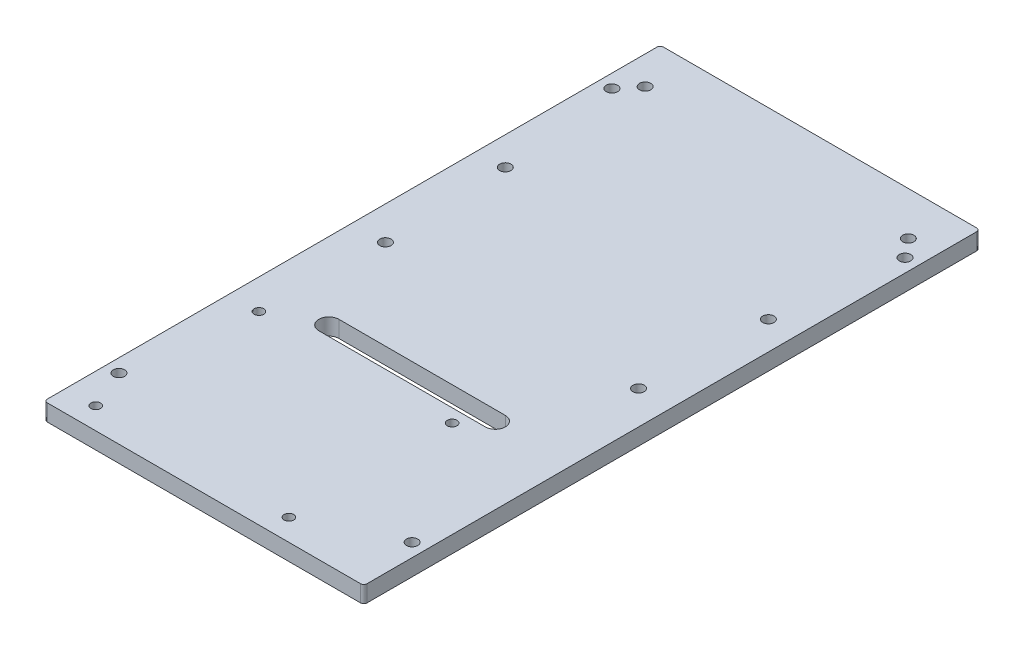
ISO-10303-21;
HEADER;
FILE_DESCRIPTION(('STEP AP214'),'2;1');
FILE_NAME('part.step','',(''),(''),'','','');
FILE_SCHEMA(('AUTOMOTIVE_DESIGN { 1 0 10303 214 1 1 1 1 }'));
ENDSEC;
DATA;
#1=APPLICATION_CONTEXT('core data for automotive mechanical design processes');
#2=APPLICATION_PROTOCOL_DEFINITION('international standard','automotive_design',2000,#1);
#3=PRODUCT_CONTEXT('',#1,'mechanical');
#4=PRODUCT('Part','Part','',(#3));
#5=PRODUCT_RELATED_PRODUCT_CATEGORY('part','',(#4));
#6=PRODUCT_DEFINITION_FORMATION('','',#4);
#7=PRODUCT_DEFINITION_CONTEXT('part definition',#1,'design');
#8=PRODUCT_DEFINITION('design','',#6,#7);
#9=PRODUCT_DEFINITION_SHAPE('','',#8);
#10=(LENGTH_UNIT() NAMED_UNIT(*) SI_UNIT(.MILLI.,.METRE.));
#11=(NAMED_UNIT(*) PLANE_ANGLE_UNIT() SI_UNIT($,.RADIAN.));
#12=(NAMED_UNIT(*) SI_UNIT($,.STERADIAN.) SOLID_ANGLE_UNIT());
#13=UNCERTAINTY_MEASURE_WITH_UNIT(LENGTH_MEASURE(1.E-05),#10,'distance_accuracy_value','');
#14=(GEOMETRIC_REPRESENTATION_CONTEXT(3) GLOBAL_UNCERTAINTY_ASSIGNED_CONTEXT((#13)) GLOBAL_UNIT_ASSIGNED_CONTEXT((#10,
#11,#12)) REPRESENTATION_CONTEXT('',''));
#15=CARTESIAN_POINT('',(0.,0.,0.));
#16=DIRECTION('',(0.,0.,1.));
#17=DIRECTION('',(1.,0.,0.));
#18=AXIS2_PLACEMENT_3D('',#15,#16,#17);
#19=CARTESIAN_POINT('',(48.,5.,-92.5));
#20=DIRECTION('',(-1.,0.,0.));
#21=DIRECTION('',(0.,0.,1.));
#22=AXIS2_PLACEMENT_3D('',#19,#20,#21);
#23=PLANE('',#22);
#24=DIRECTION('',(0.,0.,-1.));
#25=VECTOR('',#24,1.);
#26=CARTESIAN_POINT('',(48.,0.,-92.5));
#27=LINE('',#26,#25);
#28=CARTESIAN_POINT('',(48.,0.,91.5));
#29=VERTEX_POINT('',#28);
#30=CARTESIAN_POINT('',(48.,0.,-91.5));
#31=VERTEX_POINT('',#30);
#32=EDGE_CURVE('E242',#29,#31,#27,.T.);
#33=ORIENTED_EDGE('',*,*,#32,.T.);
#34=DIRECTION('',(0.,-1.,0.));
#35=VECTOR('',#34,1.);
#36=CARTESIAN_POINT('',(48.,5.,-91.5));
#37=LINE('',#36,#35);
#38=CARTESIAN_POINT('',(48.,5.,-91.5));
#39=VERTEX_POINT('',#38);
#40=EDGE_CURVE('E295',#31,#39,#37,.F.);
#41=ORIENTED_EDGE('',*,*,#40,.T.);
#42=DIRECTION('',(0.,0.,-1.));
#43=VECTOR('',#42,1.);
#44=CARTESIAN_POINT('',(48.,5.,-92.5));
#45=LINE('',#44,#43);
#46=CARTESIAN_POINT('',(48.,5.,91.5));
#47=VERTEX_POINT('',#46);
#48=EDGE_CURVE('E243',#47,#39,#45,.T.);
#49=ORIENTED_EDGE('',*,*,#48,.F.);
#50=DIRECTION('',(0.,-1.,0.));
#51=VECTOR('',#50,1.);
#52=CARTESIAN_POINT('',(48.,5.,91.5));
#53=LINE('',#52,#51);
#54=EDGE_CURVE('E292',#47,#29,#53,.T.);
#55=ORIENTED_EDGE('',*,*,#54,.T.);
#56=EDGE_LOOP('',(#33,#41,#49,#55));
#57=FACE_BOUND('',#56,.T.);
#58=ADVANCED_FACE('F34',(#57),#23,.F.);
#59=CARTESIAN_POINT('',(-48.,5.,-92.5));
#60=DIRECTION('',(0.,0.,1.));
#61=DIRECTION('',(1.,0.,0.));
#62=AXIS2_PLACEMENT_3D('',#59,#60,#61);
#63=PLANE('',#62);
#64=DIRECTION('',(-1.,0.,0.));
#65=VECTOR('',#64,1.);
#66=CARTESIAN_POINT('',(-48.,0.,-92.5));
#67=LINE('',#66,#65);
#68=CARTESIAN_POINT('',(47.,0.,-92.5));
#69=VERTEX_POINT('',#68);
#70=CARTESIAN_POINT('',(-47.,0.,-92.5));
#71=VERTEX_POINT('',#70);
#72=EDGE_CURVE('E259',#69,#71,#67,.T.);
#73=ORIENTED_EDGE('',*,*,#72,.T.);
#74=DIRECTION('',(0.,-1.,0.));
#75=VECTOR('',#74,1.);
#76=CARTESIAN_POINT('',(-47.,5.,-92.5));
#77=LINE('',#76,#75);
#78=CARTESIAN_POINT('',(-47.,5.,-92.5));
#79=VERTEX_POINT('',#78);
#80=EDGE_CURVE('E282',#71,#79,#77,.F.);
#81=ORIENTED_EDGE('',*,*,#80,.T.);
#82=DIRECTION('',(-1.,0.,0.));
#83=VECTOR('',#82,1.);
#84=CARTESIAN_POINT('',(-48.,5.,-92.5));
#85=LINE('',#84,#83);
#86=CARTESIAN_POINT('',(47.,5.,-92.5));
#87=VERTEX_POINT('',#86);
#88=EDGE_CURVE('E246',#87,#79,#85,.T.);
#89=ORIENTED_EDGE('',*,*,#88,.F.);
#90=DIRECTION('',(0.,-1.,0.));
#91=VECTOR('',#90,1.);
#92=CARTESIAN_POINT('',(47.,5.,-92.5));
#93=LINE('',#92,#91);
#94=EDGE_CURVE('E279',#87,#69,#93,.T.);
#95=ORIENTED_EDGE('',*,*,#94,.T.);
#96=EDGE_LOOP('',(#73,#81,#89,#95));
#97=FACE_BOUND('',#96,.T.);
#98=ADVANCED_FACE('F324',(#97),#63,.F.);
#99=CARTESIAN_POINT('',(-48.,5.,-92.5));
#100=DIRECTION('',(1.,0.,0.));
#101=DIRECTION('',(0.,0.,-1.));
#102=AXIS2_PLACEMENT_3D('',#99,#100,#101);
#103=PLANE('',#102);
#104=DIRECTION('',(0.,0.,1.));
#105=VECTOR('',#104,1.);
#106=CARTESIAN_POINT('',(-48.,5.,-92.5));
#107=LINE('',#106,#105);
#108=CARTESIAN_POINT('',(-48.,5.,-91.5));
#109=VERTEX_POINT('',#108);
#110=CARTESIAN_POINT('',(-48.,5.,91.5));
#111=VERTEX_POINT('',#110);
#112=EDGE_CURVE('E250',#109,#111,#107,.T.);
#113=ORIENTED_EDGE('',*,*,#112,.F.);
#114=DIRECTION('',(0.,-1.,0.));
#115=VECTOR('',#114,1.);
#116=CARTESIAN_POINT('',(-48.,5.,-91.5));
#117=LINE('',#116,#115);
#118=CARTESIAN_POINT('',(-48.,0.,-91.5));
#119=VERTEX_POINT('',#118);
#120=EDGE_CURVE('E268',#109,#119,#117,.T.);
#121=ORIENTED_EDGE('',*,*,#120,.T.);
#122=DIRECTION('',(0.,0.,1.));
#123=VECTOR('',#122,1.);
#124=CARTESIAN_POINT('',(-48.,0.,-92.5));
#125=LINE('',#124,#123);
#126=CARTESIAN_POINT('',(-48.,0.,91.5));
#127=VERTEX_POINT('',#126);
#128=EDGE_CURVE('E262',#119,#127,#125,.T.);
#129=ORIENTED_EDGE('',*,*,#128,.T.);
#130=DIRECTION('',(0.,-1.,0.));
#131=VECTOR('',#130,1.);
#132=CARTESIAN_POINT('',(-48.,5.,91.5));
#133=LINE('',#132,#131);
#134=EDGE_CURVE('E256',#127,#111,#133,.F.);
#135=ORIENTED_EDGE('',*,*,#134,.T.);
#136=EDGE_LOOP('',(#113,#121,#129,#135));
#137=FACE_BOUND('',#136,.T.);
#138=ADVANCED_FACE('F332',(#137),#103,.F.);
#139=CARTESIAN_POINT('',(-48.,5.,92.5));
#140=DIRECTION('',(0.,0.,-1.));
#141=DIRECTION('',(-1.,0.,0.));
#142=AXIS2_PLACEMENT_3D('',#139,#140,#141);
#143=PLANE('',#142);
#144=DIRECTION('',(1.,0.,0.));
#145=VECTOR('',#144,1.);
#146=CARTESIAN_POINT('',(-48.,0.,92.5));
#147=LINE('',#146,#145);
#148=CARTESIAN_POINT('',(-47.,0.,92.5));
#149=VERTEX_POINT('',#148);
#150=CARTESIAN_POINT('',(47.,0.,92.5));
#151=VERTEX_POINT('',#150);
#152=EDGE_CURVE('E247',#149,#151,#147,.T.);
#153=ORIENTED_EDGE('',*,*,#152,.T.);
#154=DIRECTION('',(0.,-1.,0.));
#155=VECTOR('',#154,1.);
#156=CARTESIAN_POINT('',(47.,5.,92.5));
#157=LINE('',#156,#155);
#158=CARTESIAN_POINT('',(47.,5.,92.5));
#159=VERTEX_POINT('',#158);
#160=EDGE_CURVE('E11',#151,#159,#157,.F.);
#161=ORIENTED_EDGE('',*,*,#160,.T.);
#162=DIRECTION('',(1.,0.,0.));
#163=VECTOR('',#162,1.);
#164=CARTESIAN_POINT('',(-48.,5.,92.5));
#165=LINE('',#164,#163);
#166=CARTESIAN_POINT('',(-47.,5.,92.5));
#167=VERTEX_POINT('',#166);
#168=EDGE_CURVE('E253',#167,#159,#165,.T.);
#169=ORIENTED_EDGE('',*,*,#168,.F.);
#170=DIRECTION('',(0.,-1.,0.));
#171=VECTOR('',#170,1.);
#172=CARTESIAN_POINT('',(-47.,5.,92.5));
#173=LINE('',#172,#171);
#174=EDGE_CURVE('E42',#167,#149,#173,.T.);
#175=ORIENTED_EDGE('',*,*,#174,.T.);
#176=EDGE_LOOP('',(#153,#161,#169,#175));
#177=FACE_BOUND('',#176,.T.);
#178=ADVANCED_FACE('F301',(#177),#143,.F.);
#179=CARTESIAN_POINT('',(0.,5.,0.));
#180=DIRECTION('',(0.,1.,0.));
#181=DIRECTION('',(0.,0.,1.));
#182=AXIS2_PLACEMENT_3D('',#179,#180,#181);
#183=PLANE('',#182);
#184=CARTESIAN_POINT('',(-25.,5.,30.));
#185=DIRECTION('',(0.,1.,0.));
#186=DIRECTION('',(0.,0.,1.));
#187=AXIS2_PLACEMENT_3D('',#184,#185,#186);
#188=CIRCLE('',#187,3.);
#189=CARTESIAN_POINT('',(-25.,5.,27.));
#190=VERTEX_POINT('',#189);
#191=CARTESIAN_POINT('',(-25.,5.,33.));
#192=VERTEX_POINT('',#191);
#193=EDGE_CURVE('E49',#190,#192,#188,.T.);
#194=ORIENTED_EDGE('',*,*,#193,.F.);
#195=DIRECTION('',(-1.,0.,0.));
#196=VECTOR('',#195,1.);
#197=CARTESIAN_POINT('',(-25.,5.,27.));
#198=LINE('',#197,#196);
#199=CARTESIAN_POINT('',(25.,5.,27.));
#200=VERTEX_POINT('',#199);
#201=EDGE_CURVE('E130',#200,#190,#198,.T.);
#202=ORIENTED_EDGE('',*,*,#201,.F.);
#203=CARTESIAN_POINT('',(25.,5.,30.));
#204=DIRECTION('',(0.,1.,0.));
#205=DIRECTION('',(0.,0.,1.));
#206=AXIS2_PLACEMENT_3D('',#203,#204,#205);
#207=CIRCLE('',#206,3.00000000000001);
#208=CARTESIAN_POINT('',(25.,5.,33.));
#209=VERTEX_POINT('',#208);
#210=EDGE_CURVE('E150',#209,#200,#207,.T.);
#211=ORIENTED_EDGE('',*,*,#210,.F.);
#212=DIRECTION('',(1.,0.,0.));
#213=VECTOR('',#212,1.);
#214=CARTESIAN_POINT('',(-25.,5.,33.));
#215=LINE('',#214,#213);
#216=EDGE_CURVE('E144',#192,#209,#215,.T.);
#217=ORIENTED_EDGE('',*,*,#216,.F.);
#218=EDGE_LOOP('',(#194,#202,#211,#217));
#219=FACE_BOUND('',#218,.T.);
#220=CARTESIAN_POINT('',(-39.49999847,5.,-79.47999944));
#221=DIRECTION('',(0.,1.,0.));
#222=DIRECTION('',(0.,0.,1.));
#223=AXIS2_PLACEMENT_3D('',#220,#221,#222);
#224=CIRCLE('',#223,1.7);
#225=CARTESIAN_POINT('',(-39.49999847,5.,-77.77999944));
#226=VERTEX_POINT('',#225);
#227=EDGE_CURVE('E136',#226,#226,#224,.T.);
#228=ORIENTED_EDGE('',*,*,#227,.F.);
#229=EDGE_LOOP('',(#228));
#230=FACE_BOUND('',#229,.T.);
#231=CARTESIAN_POINT('',(-39.49999847,5.,-37.47999962));
#232=DIRECTION('',(0.,1.,0.));
#233=DIRECTION('',(0.,0.,1.));
#234=AXIS2_PLACEMENT_3D('',#231,#232,#233);
#235=CIRCLE('',#234,1.7);
#236=CARTESIAN_POINT('',(-39.49999847,5.,-35.77999962));
#237=VERTEX_POINT('',#236);
#238=EDGE_CURVE('E164',#237,#237,#235,.T.);
#239=ORIENTED_EDGE('',*,*,#238,.F.);
#240=EDGE_LOOP('',(#239));
#241=FACE_BOUND('',#240,.T.);
#242=CARTESIAN_POINT('',(39.50000101,5.,-37.47999962));
#243=DIRECTION('',(0.,1.,0.));
#244=DIRECTION('',(0.,0.,1.));
#245=AXIS2_PLACEMENT_3D('',#242,#243,#244);
#246=CIRCLE('',#245,1.7);
#247=CARTESIAN_POINT('',(39.50000101,5.,-35.77999962));
#248=VERTEX_POINT('',#247);
#249=EDGE_CURVE('E170',#248,#248,#246,.T.);
#250=ORIENTED_EDGE('',*,*,#249,.F.);
#251=EDGE_LOOP('',(#250));
#252=FACE_BOUND('',#251,.T.);
#253=CARTESIAN_POINT('',(39.50000101,5.,-79.47999944));
#254=DIRECTION('',(0.,1.,0.));
#255=DIRECTION('',(0.,0.,1.));
#256=AXIS2_PLACEMENT_3D('',#253,#254,#255);
#257=CIRCLE('',#256,1.7);
#258=CARTESIAN_POINT('',(39.50000101,5.,-77.77999944));
#259=VERTEX_POINT('',#258);
#260=EDGE_CURVE('E176',#259,#259,#257,.T.);
#261=ORIENTED_EDGE('',*,*,#260,.F.);
#262=EDGE_LOOP('',(#261));
#263=FACE_BOUND('',#262,.T.);
#264=CARTESIAN_POINT('',(-39.,5.,85.9800000000001));
#265=DIRECTION('',(0.,1.,0.));
#266=DIRECTION('',(0.,0.,1.));
#267=AXIS2_PLACEMENT_3D('',#264,#265,#266);
#268=CIRCLE('',#267,1.45);
#269=CARTESIAN_POINT('',(-39.,5.,87.4300000000001));
#270=VERTEX_POINT('',#269);
#271=EDGE_CURVE('E182',#270,#270,#268,.T.);
#272=ORIENTED_EDGE('',*,*,#271,.F.);
#273=EDGE_LOOP('',(#272));
#274=FACE_BOUND('',#273,.T.);
#275=CARTESIAN_POINT('',(19.,5.,85.9800000000001));
#276=DIRECTION('',(0.,1.,0.));
#277=DIRECTION('',(0.,0.,1.));
#278=AXIS2_PLACEMENT_3D('',#275,#276,#277);
#279=CIRCLE('',#278,1.45);
#280=CARTESIAN_POINT('',(19.,5.,87.4300000000001));
#281=VERTEX_POINT('',#280);
#282=EDGE_CURVE('E188',#281,#281,#279,.T.);
#283=ORIENTED_EDGE('',*,*,#282,.F.);
#284=EDGE_LOOP('',(#283));
#285=FACE_BOUND('',#284,.T.);
#286=CARTESIAN_POINT('',(-39.,5.,36.9800000000001));
#287=DIRECTION('',(0.,1.,0.));
#288=DIRECTION('',(0.,0.,1.));
#289=AXIS2_PLACEMENT_3D('',#286,#287,#288);
#290=CIRCLE('',#289,1.45);
#291=CARTESIAN_POINT('',(-39.,5.,38.4300000000001));
#292=VERTEX_POINT('',#291);
#293=EDGE_CURVE('E194',#292,#292,#290,.T.);
#294=ORIENTED_EDGE('',*,*,#293,.F.);
#295=EDGE_LOOP('',(#294));
#296=FACE_BOUND('',#295,.T.);
#297=CARTESIAN_POINT('',(19.,5.,36.9800000000001));
#298=DIRECTION('',(0.,1.,0.));
#299=DIRECTION('',(0.,0.,1.));
#300=AXIS2_PLACEMENT_3D('',#297,#298,#299);
#301=CIRCLE('',#300,1.45);
#302=CARTESIAN_POINT('',(19.,5.,38.4300000000001));
#303=VERTEX_POINT('',#302);
#304=EDGE_CURVE('E200',#303,#303,#301,.T.);
#305=ORIENTED_EDGE('',*,*,#304,.F.);
#306=EDGE_LOOP('',(#305));
#307=FACE_BOUND('',#306,.T.);
#308=CARTESIAN_POINT('',(38.,5.,0.));
#309=DIRECTION('',(0.,1.,0.));
#310=DIRECTION('',(0.,0.,1.));
#311=AXIS2_PLACEMENT_3D('',#308,#309,#310);
#312=CIRCLE('',#311,1.7);
#313=CARTESIAN_POINT('',(38.,5.,1.69999999999999));
#314=VERTEX_POINT('',#313);
#315=EDGE_CURVE('E207',#314,#314,#312,.T.);
#316=ORIENTED_EDGE('',*,*,#315,.F.);
#317=EDGE_LOOP('',(#316));
#318=FACE_BOUND('',#317,.T.);
#319=CARTESIAN_POINT('',(-38.,5.,0.));
#320=DIRECTION('',(0.,1.,0.));
#321=DIRECTION('',(0.,0.,1.));
#322=AXIS2_PLACEMENT_3D('',#319,#320,#321);
#323=CIRCLE('',#322,1.7);
#324=CARTESIAN_POINT('',(-38.,5.,1.7));
#325=VERTEX_POINT('',#324);
#326=EDGE_CURVE('E206',#325,#325,#323,.T.);
#327=ORIENTED_EDGE('',*,*,#326,.F.);
#328=EDGE_LOOP('',(#327));
#329=FACE_BOUND('',#328,.T.);
#330=CARTESIAN_POINT('',(-44.,5.,-74.));
#331=DIRECTION('',(0.,1.,0.));
#332=DIRECTION('',(0.,0.,1.));
#333=AXIS2_PLACEMENT_3D('',#330,#331,#332);
#334=CIRCLE('',#333,1.7);
#335=CARTESIAN_POINT('',(-44.,5.,-72.3));
#336=VERTEX_POINT('',#335);
#337=EDGE_CURVE('E225',#336,#336,#334,.T.);
#338=ORIENTED_EDGE('',*,*,#337,.F.);
#339=EDGE_LOOP('',(#338));
#340=FACE_BOUND('',#339,.T.);
#341=CARTESIAN_POINT('',(44.,5.,74.));
#342=DIRECTION('',(0.,1.,0.));
#343=DIRECTION('',(0.,0.,1.));
#344=AXIS2_PLACEMENT_3D('',#341,#342,#343);
#345=CIRCLE('',#344,1.70000000000001);
#346=CARTESIAN_POINT('',(44.,5.,75.7));
#347=VERTEX_POINT('',#346);
#348=EDGE_CURVE('E224',#347,#347,#345,.T.);
#349=ORIENTED_EDGE('',*,*,#348,.F.);
#350=EDGE_LOOP('',(#349));
#351=FACE_BOUND('',#350,.T.);
#352=CARTESIAN_POINT('',(-44.,5.,74.));
#353=DIRECTION('',(0.,1.,0.));
#354=DIRECTION('',(0.,0.,1.));
#355=AXIS2_PLACEMENT_3D('',#352,#353,#354);
#356=CIRCLE('',#355,1.7);
#357=CARTESIAN_POINT('',(-44.,5.,75.7));
#358=VERTEX_POINT('',#357);
#359=EDGE_CURVE('E214',#358,#358,#356,.T.);
#360=ORIENTED_EDGE('',*,*,#359,.F.);
#361=EDGE_LOOP('',(#360));
#362=FACE_BOUND('',#361,.T.);
#363=CARTESIAN_POINT('',(44.,5.,-74.));
#364=DIRECTION('',(0.,1.,0.));
#365=DIRECTION('',(0.,0.,1.));
#366=AXIS2_PLACEMENT_3D('',#363,#364,#365);
#367=CIRCLE('',#366,1.70000000000001);
#368=CARTESIAN_POINT('',(44.,5.,-72.3));
#369=VERTEX_POINT('',#368);
#370=EDGE_CURVE('E232',#369,#369,#367,.T.);
#371=ORIENTED_EDGE('',*,*,#370,.F.);
#372=EDGE_LOOP('',(#371));
#373=FACE_BOUND('',#372,.T.);
#374=ORIENTED_EDGE('',*,*,#88,.T.);
#375=CARTESIAN_POINT('',(-47.,5.,-91.5));
#376=DIRECTION('',(0.,1.,0.));
#377=DIRECTION('',(0.,0.,1.));
#378=AXIS2_PLACEMENT_3D('',#375,#376,#377);
#379=CIRCLE('',#378,1.);
#380=EDGE_CURVE('E290',#79,#109,#379,.T.);
#381=ORIENTED_EDGE('',*,*,#380,.T.);
#382=ORIENTED_EDGE('',*,*,#112,.T.);
#383=CARTESIAN_POINT('',(-47.,5.,91.5));
#384=DIRECTION('',(0.,1.,0.));
#385=DIRECTION('',(0.,0.,1.));
#386=AXIS2_PLACEMENT_3D('',#383,#384,#385);
#387=CIRCLE('',#386,1.);
#388=EDGE_CURVE('E284',#111,#167,#387,.T.);
#389=ORIENTED_EDGE('',*,*,#388,.T.);
#390=ORIENTED_EDGE('',*,*,#168,.T.);
#391=CARTESIAN_POINT('',(47.,5.,91.5));
#392=DIRECTION('',(0.,1.,0.));
#393=DIRECTION('',(0.,0.,1.));
#394=AXIS2_PLACEMENT_3D('',#391,#392,#393);
#395=CIRCLE('',#394,1.);
#396=EDGE_CURVE('E286',#159,#47,#395,.T.);
#397=ORIENTED_EDGE('',*,*,#396,.T.);
#398=ORIENTED_EDGE('',*,*,#48,.T.);
#399=CARTESIAN_POINT('',(47.,5.,-91.5));
#400=DIRECTION('',(0.,1.,0.));
#401=DIRECTION('',(0.,0.,1.));
#402=AXIS2_PLACEMENT_3D('',#399,#400,#401);
#403=CIRCLE('',#402,1.);
#404=EDGE_CURVE('E288',#39,#87,#403,.T.);
#405=ORIENTED_EDGE('',*,*,#404,.T.);
#406=EDGE_LOOP('',(#374,#381,#382,#389,#390,#397,#398,#405));
#407=FACE_BOUND('',#406,.T.);
#408=ADVANCED_FACE('F317',(#219,#230,#241,#252,#263,#274,#285,#296,#307,#318,#329,#340,#351,
#362,#373,#407),#183,.T.);
#409=CARTESIAN_POINT('',(0.,0.,0.));
#410=DIRECTION('',(0.,1.,0.));
#411=DIRECTION('',(0.,0.,1.));
#412=AXIS2_PLACEMENT_3D('',#409,#410,#411);
#413=PLANE('',#412);
#414=DIRECTION('',(1.,0.,0.));
#415=VECTOR('',#414,1.);
#416=CARTESIAN_POINT('',(-25.,0.,27.));
#417=LINE('',#416,#415);
#418=CARTESIAN_POINT('',(-25.,0.,27.));
#419=VERTEX_POINT('',#418);
#420=CARTESIAN_POINT('',(25.,0.,27.));
#421=VERTEX_POINT('',#420);
#422=EDGE_CURVE('E142',#419,#421,#417,.T.);
#423=ORIENTED_EDGE('',*,*,#422,.F.);
#424=CARTESIAN_POINT('',(-25.,0.,30.));
#425=DIRECTION('',(0.,1.,0.));
#426=DIRECTION('',(0.,0.,1.));
#427=AXIS2_PLACEMENT_3D('',#424,#425,#426);
#428=CIRCLE('',#427,3.);
#429=CARTESIAN_POINT('',(-25.,0.,33.));
#430=VERTEX_POINT('',#429);
#431=EDGE_CURVE('E124',#430,#419,#428,.F.);
#432=ORIENTED_EDGE('',*,*,#431,.F.);
#433=DIRECTION('',(-1.,0.,0.));
#434=VECTOR('',#433,1.);
#435=CARTESIAN_POINT('',(-25.,0.,33.));
#436=LINE('',#435,#434);
#437=CARTESIAN_POINT('',(25.,0.,33.));
#438=VERTEX_POINT('',#437);
#439=EDGE_CURVE('E133',#438,#430,#436,.T.);
#440=ORIENTED_EDGE('',*,*,#439,.F.);
#441=CARTESIAN_POINT('',(25.,0.,30.));
#442=DIRECTION('',(0.,1.,0.));
#443=DIRECTION('',(0.,0.,1.));
#444=AXIS2_PLACEMENT_3D('',#441,#442,#443);
#445=CIRCLE('',#444,3.00000000000001);
#446=EDGE_CURVE('E57',#421,#438,#445,.F.);
#447=ORIENTED_EDGE('',*,*,#446,.F.);
#448=EDGE_LOOP('',(#423,#432,#440,#447));
#449=FACE_BOUND('',#448,.T.);
#450=CARTESIAN_POINT('',(-39.49999847,0.,-79.47999944));
#451=DIRECTION('',(0.,1.,0.));
#452=DIRECTION('',(0.,0.,1.));
#453=AXIS2_PLACEMENT_3D('',#450,#451,#452);
#454=CIRCLE('',#453,1.7);
#455=CARTESIAN_POINT('',(-39.49999847,0.,-77.77999944));
#456=VERTEX_POINT('',#455);
#457=EDGE_CURVE('E161',#456,#456,#454,.T.);
#458=ORIENTED_EDGE('',*,*,#457,.T.);
#459=EDGE_LOOP('',(#458));
#460=FACE_BOUND('',#459,.T.);
#461=CARTESIAN_POINT('',(-39.49999847,0.,-37.47999962));
#462=DIRECTION('',(0.,1.,0.));
#463=DIRECTION('',(0.,0.,1.));
#464=AXIS2_PLACEMENT_3D('',#461,#462,#463);
#465=CIRCLE('',#464,1.7);
#466=CARTESIAN_POINT('',(-39.49999847,0.,-35.77999962));
#467=VERTEX_POINT('',#466);
#468=EDGE_CURVE('E167',#467,#467,#465,.T.);
#469=ORIENTED_EDGE('',*,*,#468,.T.);
#470=EDGE_LOOP('',(#469));
#471=FACE_BOUND('',#470,.T.);
#472=CARTESIAN_POINT('',(39.50000101,0.,-37.47999962));
#473=DIRECTION('',(0.,1.,0.));
#474=DIRECTION('',(0.,0.,1.));
#475=AXIS2_PLACEMENT_3D('',#472,#473,#474);
#476=CIRCLE('',#475,1.7);
#477=CARTESIAN_POINT('',(39.50000101,0.,-35.77999962));
#478=VERTEX_POINT('',#477);
#479=EDGE_CURVE('E173',#478,#478,#476,.T.);
#480=ORIENTED_EDGE('',*,*,#479,.T.);
#481=EDGE_LOOP('',(#480));
#482=FACE_BOUND('',#481,.T.);
#483=CARTESIAN_POINT('',(39.50000101,0.,-79.47999944));
#484=DIRECTION('',(0.,1.,0.));
#485=DIRECTION('',(0.,0.,1.));
#486=AXIS2_PLACEMENT_3D('',#483,#484,#485);
#487=CIRCLE('',#486,1.7);
#488=CARTESIAN_POINT('',(39.50000101,0.,-77.77999944));
#489=VERTEX_POINT('',#488);
#490=EDGE_CURVE('E179',#489,#489,#487,.T.);
#491=ORIENTED_EDGE('',*,*,#490,.T.);
#492=EDGE_LOOP('',(#491));
#493=FACE_BOUND('',#492,.T.);
#494=CARTESIAN_POINT('',(-39.,0.,85.9800000000001));
#495=DIRECTION('',(0.,1.,0.));
#496=DIRECTION('',(0.,0.,1.));
#497=AXIS2_PLACEMENT_3D('',#494,#495,#496);
#498=CIRCLE('',#497,1.45);
#499=CARTESIAN_POINT('',(-39.,0.,87.4300000000001));
#500=VERTEX_POINT('',#499);
#501=EDGE_CURVE('E185',#500,#500,#498,.T.);
#502=ORIENTED_EDGE('',*,*,#501,.T.);
#503=EDGE_LOOP('',(#502));
#504=FACE_BOUND('',#503,.T.);
#505=CARTESIAN_POINT('',(19.,0.,85.9800000000001));
#506=DIRECTION('',(0.,1.,0.));
#507=DIRECTION('',(0.,0.,1.));
#508=AXIS2_PLACEMENT_3D('',#505,#506,#507);
#509=CIRCLE('',#508,1.45);
#510=CARTESIAN_POINT('',(19.,0.,87.4300000000001));
#511=VERTEX_POINT('',#510);
#512=EDGE_CURVE('E191',#511,#511,#509,.T.);
#513=ORIENTED_EDGE('',*,*,#512,.T.);
#514=EDGE_LOOP('',(#513));
#515=FACE_BOUND('',#514,.T.);
#516=CARTESIAN_POINT('',(-39.,0.,36.9800000000001));
#517=DIRECTION('',(0.,1.,0.));
#518=DIRECTION('',(0.,0.,1.));
#519=AXIS2_PLACEMENT_3D('',#516,#517,#518);
#520=CIRCLE('',#519,1.45);
#521=CARTESIAN_POINT('',(-39.,0.,38.4300000000001));
#522=VERTEX_POINT('',#521);
#523=EDGE_CURVE('E197',#522,#522,#520,.T.);
#524=ORIENTED_EDGE('',*,*,#523,.T.);
#525=EDGE_LOOP('',(#524));
#526=FACE_BOUND('',#525,.T.);
#527=CARTESIAN_POINT('',(19.,0.,36.9800000000001));
#528=DIRECTION('',(0.,1.,0.));
#529=DIRECTION('',(0.,0.,1.));
#530=AXIS2_PLACEMENT_3D('',#527,#528,#529);
#531=CIRCLE('',#530,1.45);
#532=CARTESIAN_POINT('',(19.,0.,38.4300000000001));
#533=VERTEX_POINT('',#532);
#534=EDGE_CURVE('E203',#533,#533,#531,.T.);
#535=ORIENTED_EDGE('',*,*,#534,.T.);
#536=EDGE_LOOP('',(#535));
#537=FACE_BOUND('',#536,.T.);
#538=CARTESIAN_POINT('',(38.,0.,0.));
#539=DIRECTION('',(0.,1.,0.));
#540=DIRECTION('',(0.,0.,1.));
#541=AXIS2_PLACEMENT_3D('',#538,#539,#540);
#542=CIRCLE('',#541,1.7);
#543=CARTESIAN_POINT('',(38.,0.,1.69999999999999));
#544=VERTEX_POINT('',#543);
#545=EDGE_CURVE('E210',#544,#544,#542,.F.);
#546=ORIENTED_EDGE('',*,*,#545,.F.);
#547=EDGE_LOOP('',(#546));
#548=FACE_BOUND('',#547,.T.);
#549=CARTESIAN_POINT('',(-38.,0.,0.));
#550=DIRECTION('',(0.,1.,0.));
#551=DIRECTION('',(0.,0.,1.));
#552=AXIS2_PLACEMENT_3D('',#549,#550,#551);
#553=CIRCLE('',#552,1.7);
#554=CARTESIAN_POINT('',(-38.,0.,1.7));
#555=VERTEX_POINT('',#554);
#556=EDGE_CURVE('E211',#555,#555,#553,.F.);
#557=ORIENTED_EDGE('',*,*,#556,.F.);
#558=EDGE_LOOP('',(#557));
#559=FACE_BOUND('',#558,.T.);
#560=CARTESIAN_POINT('',(-44.,0.,-74.));
#561=DIRECTION('',(0.,1.,0.));
#562=DIRECTION('',(0.,0.,1.));
#563=AXIS2_PLACEMENT_3D('',#560,#561,#562);
#564=CIRCLE('',#563,1.7);
#565=CARTESIAN_POINT('',(-44.,0.,-72.3));
#566=VERTEX_POINT('',#565);
#567=EDGE_CURVE('E228',#566,#566,#564,.F.);
#568=ORIENTED_EDGE('',*,*,#567,.F.);
#569=EDGE_LOOP('',(#568));
#570=FACE_BOUND('',#569,.T.);
#571=CARTESIAN_POINT('',(44.,0.,74.));
#572=DIRECTION('',(0.,1.,0.));
#573=DIRECTION('',(0.,0.,1.));
#574=AXIS2_PLACEMENT_3D('',#571,#572,#573);
#575=CIRCLE('',#574,1.70000000000001);
#576=CARTESIAN_POINT('',(44.,0.,75.7));
#577=VERTEX_POINT('',#576);
#578=EDGE_CURVE('E229',#577,#577,#575,.F.);
#579=ORIENTED_EDGE('',*,*,#578,.F.);
#580=EDGE_LOOP('',(#579));
#581=FACE_BOUND('',#580,.T.);
#582=CARTESIAN_POINT('',(-44.,0.,74.));
#583=DIRECTION('',(0.,1.,0.));
#584=DIRECTION('',(0.,0.,1.));
#585=AXIS2_PLACEMENT_3D('',#582,#583,#584);
#586=CIRCLE('',#585,1.7);
#587=CARTESIAN_POINT('',(-44.,0.,75.7));
#588=VERTEX_POINT('',#587);
#589=EDGE_CURVE('E221',#588,#588,#586,.F.);
#590=ORIENTED_EDGE('',*,*,#589,.F.);
#591=EDGE_LOOP('',(#590));
#592=FACE_BOUND('',#591,.T.);
#593=CARTESIAN_POINT('',(44.,0.,-74.));
#594=DIRECTION('',(0.,1.,0.));
#595=DIRECTION('',(0.,0.,1.));
#596=AXIS2_PLACEMENT_3D('',#593,#594,#595);
#597=CIRCLE('',#596,1.70000000000001);
#598=CARTESIAN_POINT('',(44.,0.,-72.3));
#599=VERTEX_POINT('',#598);
#600=EDGE_CURVE('E239',#599,#599,#597,.F.);
#601=ORIENTED_EDGE('',*,*,#600,.F.);
#602=EDGE_LOOP('',(#601));
#603=FACE_BOUND('',#602,.T.);
#604=ORIENTED_EDGE('',*,*,#128,.F.);
#605=CARTESIAN_POINT('',(-47.,0.,-91.5));
#606=DIRECTION('',(0.,1.,0.));
#607=DIRECTION('',(0.,0.,1.));
#608=AXIS2_PLACEMENT_3D('',#605,#606,#607);
#609=CIRCLE('',#608,1.);
#610=EDGE_CURVE('E277',#119,#71,#609,.F.);
#611=ORIENTED_EDGE('',*,*,#610,.T.);
#612=ORIENTED_EDGE('',*,*,#72,.F.);
#613=CARTESIAN_POINT('',(47.,0.,-91.5));
#614=DIRECTION('',(0.,1.,0.));
#615=DIRECTION('',(0.,0.,1.));
#616=AXIS2_PLACEMENT_3D('',#613,#614,#615);
#617=CIRCLE('',#616,1.);
#618=EDGE_CURVE('E275',#69,#31,#617,.F.);
#619=ORIENTED_EDGE('',*,*,#618,.T.);
#620=ORIENTED_EDGE('',*,*,#32,.F.);
#621=CARTESIAN_POINT('',(47.,0.,91.5));
#622=DIRECTION('',(0.,1.,0.));
#623=DIRECTION('',(0.,0.,1.));
#624=AXIS2_PLACEMENT_3D('',#621,#622,#623);
#625=CIRCLE('',#624,1.);
#626=EDGE_CURVE('E273',#29,#151,#625,.F.);
#627=ORIENTED_EDGE('',*,*,#626,.T.);
#628=ORIENTED_EDGE('',*,*,#152,.F.);
#629=CARTESIAN_POINT('',(-47.,0.,91.5));
#630=DIRECTION('',(0.,1.,0.));
#631=DIRECTION('',(0.,0.,1.));
#632=AXIS2_PLACEMENT_3D('',#629,#630,#631);
#633=CIRCLE('',#632,1.);
#634=EDGE_CURVE('E271',#149,#127,#633,.F.);
#635=ORIENTED_EDGE('',*,*,#634,.T.);
#636=EDGE_LOOP('',(#604,#611,#612,#619,#620,#627,#628,#635));
#637=FACE_BOUND('',#636,.T.);
#638=ADVANCED_FACE('F139',(#449,#460,#471,#482,#493,#504,#515,#526,#537,#548,#559,#570,#581,
#592,#603,#637),#413,.F.);
#639=CARTESIAN_POINT('',(44.,-0.00100000000000013,-74.));
#640=DIRECTION('',(0.,1.,0.));
#641=DIRECTION('',(0.,0.,1.));
#642=AXIS2_PLACEMENT_3D('',#639,#640,#641);
#643=CYLINDRICAL_SURFACE('',#642,1.70000000000001);
#644=ORIENTED_EDGE('',*,*,#370,.T.);
#645=EDGE_LOOP('',(#644));
#646=FACE_BOUND('',#645,.T.);
#647=ORIENTED_EDGE('',*,*,#600,.T.);
#648=EDGE_LOOP('',(#647));
#649=FACE_BOUND('',#648,.T.);
#650=ADVANCED_FACE('F461',(#646,#649),#643,.F.);
#651=CARTESIAN_POINT('',(-44.,-0.00100000000000013,74.));
#652=DIRECTION('',(0.,1.,0.));
#653=DIRECTION('',(0.,0.,1.));
#654=AXIS2_PLACEMENT_3D('',#651,#652,#653);
#655=CYLINDRICAL_SURFACE('',#654,1.7);
#656=ORIENTED_EDGE('',*,*,#359,.T.);
#657=EDGE_LOOP('',(#656));
#658=FACE_BOUND('',#657,.T.);
#659=ORIENTED_EDGE('',*,*,#589,.T.);
#660=EDGE_LOOP('',(#659));
#661=FACE_BOUND('',#660,.T.);
#662=ADVANCED_FACE('F506',(#658,#661),#655,.F.);
#663=CARTESIAN_POINT('',(44.,-0.00100000000000013,74.));
#664=DIRECTION('',(0.,1.,0.));
#665=DIRECTION('',(0.,0.,1.));
#666=AXIS2_PLACEMENT_3D('',#663,#664,#665);
#667=CYLINDRICAL_SURFACE('',#666,1.70000000000001);
#668=ORIENTED_EDGE('',*,*,#348,.T.);
#669=EDGE_LOOP('',(#668));
#670=FACE_BOUND('',#669,.T.);
#671=ORIENTED_EDGE('',*,*,#578,.T.);
#672=EDGE_LOOP('',(#671));
#673=FACE_BOUND('',#672,.T.);
#674=ADVANCED_FACE('F509',(#670,#673),#667,.F.);
#675=CARTESIAN_POINT('',(-44.,-0.00100000000000013,-74.));
#676=DIRECTION('',(0.,1.,0.));
#677=DIRECTION('',(0.,0.,1.));
#678=AXIS2_PLACEMENT_3D('',#675,#676,#677);
#679=CYLINDRICAL_SURFACE('',#678,1.7);
#680=ORIENTED_EDGE('',*,*,#337,.T.);
#681=EDGE_LOOP('',(#680));
#682=FACE_BOUND('',#681,.T.);
#683=ORIENTED_EDGE('',*,*,#567,.T.);
#684=EDGE_LOOP('',(#683));
#685=FACE_BOUND('',#684,.T.);
#686=ADVANCED_FACE('F504',(#682,#685),#679,.F.);
#687=CARTESIAN_POINT('',(-38.,-0.00100000000000013,0.));
#688=DIRECTION('',(0.,1.,0.));
#689=DIRECTION('',(0.,0.,1.));
#690=AXIS2_PLACEMENT_3D('',#687,#688,#689);
#691=CYLINDRICAL_SURFACE('',#690,1.7);
#692=ORIENTED_EDGE('',*,*,#326,.T.);
#693=EDGE_LOOP('',(#692));
#694=FACE_BOUND('',#693,.T.);
#695=ORIENTED_EDGE('',*,*,#556,.T.);
#696=EDGE_LOOP('',(#695));
#697=FACE_BOUND('',#696,.T.);
#698=ADVANCED_FACE('F500',(#694,#697),#691,.F.);
#699=CARTESIAN_POINT('',(38.,-0.00100000000000013,0.));
#700=DIRECTION('',(0.,1.,0.));
#701=DIRECTION('',(0.,0.,1.));
#702=AXIS2_PLACEMENT_3D('',#699,#700,#701);
#703=CYLINDRICAL_SURFACE('',#702,1.7);
#704=ORIENTED_EDGE('',*,*,#315,.T.);
#705=EDGE_LOOP('',(#704));
#706=FACE_BOUND('',#705,.T.);
#707=ORIENTED_EDGE('',*,*,#545,.T.);
#708=EDGE_LOOP('',(#707));
#709=FACE_BOUND('',#708,.T.);
#710=ADVANCED_FACE('F353',(#706,#709),#703,.F.);
#711=CARTESIAN_POINT('',(-47.,5.,-91.5));
#712=DIRECTION('',(0.,-1.,0.));
#713=DIRECTION('',(0.,0.,-1.));
#714=AXIS2_PLACEMENT_3D('',#711,#712,#713);
#715=CYLINDRICAL_SURFACE('',#714,1.);
#716=ORIENTED_EDGE('',*,*,#380,.F.);
#717=ORIENTED_EDGE('',*,*,#80,.F.);
#718=ORIENTED_EDGE('',*,*,#610,.F.);
#719=ORIENTED_EDGE('',*,*,#120,.F.);
#720=EDGE_LOOP('',(#716,#717,#718,#719));
#721=FACE_BOUND('',#720,.T.);
#722=ADVANCED_FACE('F329',(#721),#715,.T.);
#723=CARTESIAN_POINT('',(47.,5.,-91.5));
#724=DIRECTION('',(0.,-1.,0.));
#725=DIRECTION('',(0.,0.,-1.));
#726=AXIS2_PLACEMENT_3D('',#723,#724,#725);
#727=CYLINDRICAL_SURFACE('',#726,1.);
#728=ORIENTED_EDGE('',*,*,#404,.F.);
#729=ORIENTED_EDGE('',*,*,#40,.F.);
#730=ORIENTED_EDGE('',*,*,#618,.F.);
#731=ORIENTED_EDGE('',*,*,#94,.F.);
#732=EDGE_LOOP('',(#728,#729,#730,#731));
#733=FACE_BOUND('',#732,.T.);
#734=ADVANCED_FACE('F321',(#733),#727,.T.);
#735=CARTESIAN_POINT('',(47.,5.,91.5));
#736=DIRECTION('',(0.,-1.,0.));
#737=DIRECTION('',(0.,0.,-1.));
#738=AXIS2_PLACEMENT_3D('',#735,#736,#737);
#739=CYLINDRICAL_SURFACE('',#738,1.);
#740=ORIENTED_EDGE('',*,*,#396,.F.);
#741=ORIENTED_EDGE('',*,*,#160,.F.);
#742=ORIENTED_EDGE('',*,*,#626,.F.);
#743=ORIENTED_EDGE('',*,*,#54,.F.);
#744=EDGE_LOOP('',(#740,#741,#742,#743));
#745=FACE_BOUND('',#744,.T.);
#746=ADVANCED_FACE('F311',(#745),#739,.T.);
#747=CARTESIAN_POINT('',(-47.,5.,91.5));
#748=DIRECTION('',(0.,-1.,0.));
#749=DIRECTION('',(0.,0.,-1.));
#750=AXIS2_PLACEMENT_3D('',#747,#748,#749);
#751=CYLINDRICAL_SURFACE('',#750,1.);
#752=ORIENTED_EDGE('',*,*,#388,.F.);
#753=ORIENTED_EDGE('',*,*,#134,.F.);
#754=ORIENTED_EDGE('',*,*,#634,.F.);
#755=ORIENTED_EDGE('',*,*,#174,.F.);
#756=EDGE_LOOP('',(#752,#753,#754,#755));
#757=FACE_BOUND('',#756,.T.);
#758=ADVANCED_FACE('F36',(#757),#751,.T.);
#759=CARTESIAN_POINT('',(19.,5.,36.9800000000001));
#760=DIRECTION('',(0.,1.,0.));
#761=DIRECTION('',(0.,0.,1.));
#762=AXIS2_PLACEMENT_3D('',#759,#760,#761);
#763=CYLINDRICAL_SURFACE('',#762,1.45);
#764=ORIENTED_EDGE('',*,*,#534,.F.);
#765=EDGE_LOOP('',(#764));
#766=FACE_BOUND('',#765,.T.);
#767=ORIENTED_EDGE('',*,*,#304,.T.);
#768=EDGE_LOOP('',(#767));
#769=FACE_BOUND('',#768,.T.);
#770=ADVANCED_FACE('F335',(#766,#769),#763,.F.);
#771=CARTESIAN_POINT('',(-39.,5.,36.9800000000001));
#772=DIRECTION('',(0.,1.,0.));
#773=DIRECTION('',(0.,0.,1.));
#774=AXIS2_PLACEMENT_3D('',#771,#772,#773);
#775=CYLINDRICAL_SURFACE('',#774,1.45);
#776=ORIENTED_EDGE('',*,*,#523,.F.);
#777=EDGE_LOOP('',(#776));
#778=FACE_BOUND('',#777,.T.);
#779=ORIENTED_EDGE('',*,*,#293,.T.);
#780=EDGE_LOOP('',(#779));
#781=FACE_BOUND('',#780,.T.);
#782=ADVANCED_FACE('F340',(#778,#781),#775,.F.);
#783=CARTESIAN_POINT('',(19.,5.,85.9800000000001));
#784=DIRECTION('',(0.,1.,0.));
#785=DIRECTION('',(0.,0.,1.));
#786=AXIS2_PLACEMENT_3D('',#783,#784,#785);
#787=CYLINDRICAL_SURFACE('',#786,1.45);
#788=ORIENTED_EDGE('',*,*,#512,.F.);
#789=EDGE_LOOP('',(#788));
#790=FACE_BOUND('',#789,.T.);
#791=ORIENTED_EDGE('',*,*,#282,.T.);
#792=EDGE_LOOP('',(#791));
#793=FACE_BOUND('',#792,.T.);
#794=ADVANCED_FACE('F383',(#790,#793),#787,.F.);
#795=CARTESIAN_POINT('',(-39.,5.,85.9800000000001));
#796=DIRECTION('',(0.,1.,0.));
#797=DIRECTION('',(0.,0.,1.));
#798=AXIS2_PLACEMENT_3D('',#795,#796,#797);
#799=CYLINDRICAL_SURFACE('',#798,1.45);
#800=ORIENTED_EDGE('',*,*,#501,.F.);
#801=EDGE_LOOP('',(#800));
#802=FACE_BOUND('',#801,.T.);
#803=ORIENTED_EDGE('',*,*,#271,.T.);
#804=EDGE_LOOP('',(#803));
#805=FACE_BOUND('',#804,.T.);
#806=ADVANCED_FACE('F393',(#802,#805),#799,.F.);
#807=CARTESIAN_POINT('',(39.50000101,5.,-79.47999944));
#808=DIRECTION('',(0.,1.,0.));
#809=DIRECTION('',(0.,0.,1.));
#810=AXIS2_PLACEMENT_3D('',#807,#808,#809);
#811=CYLINDRICAL_SURFACE('',#810,1.7);
#812=ORIENTED_EDGE('',*,*,#490,.F.);
#813=EDGE_LOOP('',(#812));
#814=FACE_BOUND('',#813,.T.);
#815=ORIENTED_EDGE('',*,*,#260,.T.);
#816=EDGE_LOOP('',(#815));
#817=FACE_BOUND('',#816,.T.);
#818=ADVANCED_FACE('F403',(#814,#817),#811,.F.);
#819=CARTESIAN_POINT('',(39.50000101,5.,-37.47999962));
#820=DIRECTION('',(0.,1.,0.));
#821=DIRECTION('',(0.,0.,1.));
#822=AXIS2_PLACEMENT_3D('',#819,#820,#821);
#823=CYLINDRICAL_SURFACE('',#822,1.7);
#824=ORIENTED_EDGE('',*,*,#479,.F.);
#825=EDGE_LOOP('',(#824));
#826=FACE_BOUND('',#825,.T.);
#827=ORIENTED_EDGE('',*,*,#249,.T.);
#828=EDGE_LOOP('',(#827));
#829=FACE_BOUND('',#828,.T.);
#830=ADVANCED_FACE('F413',(#826,#829),#823,.F.);
#831=CARTESIAN_POINT('',(-39.49999847,5.,-37.47999962));
#832=DIRECTION('',(0.,1.,0.));
#833=DIRECTION('',(0.,0.,1.));
#834=AXIS2_PLACEMENT_3D('',#831,#832,#833);
#835=CYLINDRICAL_SURFACE('',#834,1.7);
#836=ORIENTED_EDGE('',*,*,#468,.F.);
#837=EDGE_LOOP('',(#836));
#838=FACE_BOUND('',#837,.T.);
#839=ORIENTED_EDGE('',*,*,#238,.T.);
#840=EDGE_LOOP('',(#839));
#841=FACE_BOUND('',#840,.T.);
#842=ADVANCED_FACE('F423',(#838,#841),#835,.F.);
#843=CARTESIAN_POINT('',(-39.49999847,5.,-79.47999944));
#844=DIRECTION('',(0.,1.,0.));
#845=DIRECTION('',(0.,0.,1.));
#846=AXIS2_PLACEMENT_3D('',#843,#844,#845);
#847=CYLINDRICAL_SURFACE('',#846,1.7);
#848=ORIENTED_EDGE('',*,*,#457,.F.);
#849=EDGE_LOOP('',(#848));
#850=FACE_BOUND('',#849,.T.);
#851=ORIENTED_EDGE('',*,*,#227,.T.);
#852=EDGE_LOOP('',(#851));
#853=FACE_BOUND('',#852,.T.);
#854=ADVANCED_FACE('F433',(#850,#853),#847,.F.);
#855=CARTESIAN_POINT('',(-25.,-0.00100000000000013,30.));
#856=DIRECTION('',(0.,1.,0.));
#857=DIRECTION('',(0.,0.,1.));
#858=AXIS2_PLACEMENT_3D('',#855,#856,#857);
#859=CYLINDRICAL_SURFACE('',#858,3.);
#860=ORIENTED_EDGE('',*,*,#431,.T.);
#861=DIRECTION('',(0.,1.,0.));
#862=VECTOR('',#861,1.);
#863=CARTESIAN_POINT('',(-25.,-0.00100000000000013,27.));
#864=LINE('',#863,#862);
#865=EDGE_CURVE('E137',#419,#190,#864,.T.);
#866=ORIENTED_EDGE('',*,*,#865,.T.);
#867=ORIENTED_EDGE('',*,*,#193,.T.);
#868=DIRECTION('',(0.,1.,0.));
#869=VECTOR('',#868,1.);
#870=CARTESIAN_POINT('',(-25.,-0.00100000000000013,33.));
#871=LINE('',#870,#869);
#872=EDGE_CURVE('E120',#430,#192,#871,.T.);
#873=ORIENTED_EDGE('',*,*,#872,.F.);
#874=EDGE_LOOP('',(#860,#866,#867,#873));
#875=FACE_BOUND('',#874,.T.);
#876=ADVANCED_FACE('F122',(#875),#859,.F.);
#877=CARTESIAN_POINT('',(-25.,-0.00100000000000013,27.));
#878=DIRECTION('',(0.,0.,-1.));
#879=DIRECTION('',(-1.,0.,0.));
#880=AXIS2_PLACEMENT_3D('',#877,#878,#879);
#881=PLANE('',#880);
#882=ORIENTED_EDGE('',*,*,#422,.T.);
#883=DIRECTION('',(0.,1.,0.));
#884=VECTOR('',#883,1.);
#885=CARTESIAN_POINT('',(25.,-0.00100000000000013,27.));
#886=LINE('',#885,#884);
#887=EDGE_CURVE('E156',#421,#200,#886,.T.);
#888=ORIENTED_EDGE('',*,*,#887,.T.);
#889=ORIENTED_EDGE('',*,*,#201,.T.);
#890=ORIENTED_EDGE('',*,*,#865,.F.);
#891=EDGE_LOOP('',(#882,#888,#889,#890));
#892=FACE_BOUND('',#891,.T.);
#893=ADVANCED_FACE('F468',(#892),#881,.F.);
#894=CARTESIAN_POINT('',(25.,-0.00100000000000013,30.));
#895=DIRECTION('',(0.,1.,0.));
#896=DIRECTION('',(0.,0.,1.));
#897=AXIS2_PLACEMENT_3D('',#894,#895,#896);
#898=CYLINDRICAL_SURFACE('',#897,3.00000000000001);
#899=ORIENTED_EDGE('',*,*,#446,.T.);
#900=DIRECTION('',(0.,1.,0.));
#901=VECTOR('',#900,1.);
#902=CARTESIAN_POINT('',(25.,-0.00100000000000013,33.));
#903=LINE('',#902,#901);
#904=EDGE_CURVE('E129',#438,#209,#903,.T.);
#905=ORIENTED_EDGE('',*,*,#904,.T.);
#906=ORIENTED_EDGE('',*,*,#210,.T.);
#907=ORIENTED_EDGE('',*,*,#887,.F.);
#908=EDGE_LOOP('',(#899,#905,#906,#907));
#909=FACE_BOUND('',#908,.T.);
#910=ADVANCED_FACE('F477',(#909),#898,.F.);
#911=CARTESIAN_POINT('',(-25.,-0.00100000000000013,33.));
#912=DIRECTION('',(0.,0.,1.));
#913=DIRECTION('',(1.,0.,0.));
#914=AXIS2_PLACEMENT_3D('',#911,#912,#913);
#915=PLANE('',#914);
#916=ORIENTED_EDGE('',*,*,#439,.T.);
#917=ORIENTED_EDGE('',*,*,#872,.T.);
#918=ORIENTED_EDGE('',*,*,#216,.T.);
#919=ORIENTED_EDGE('',*,*,#904,.F.);
#920=EDGE_LOOP('',(#916,#917,#918,#919));
#921=FACE_BOUND('',#920,.T.);
#922=ADVANCED_FACE('F134',(#921),#915,.F.);
#923=CLOSED_SHELL('',(#58,#98,#138,#178,#408,#638,#650,#662,#674,#686,#698,#710,#722,#734,#746,
#758,#770,#782,#794,#806,#818,#830,#842,#854,#876,#893,#910,#922));
#924=MANIFOLD_SOLID_BREP('B2',#923);
#925=ADVANCED_BREP_SHAPE_REPRESENTATION('',(#18,#924),#14);
#926=SHAPE_DEFINITION_REPRESENTATION(#9,#925);
ENDSEC;
END-ISO-10303-21;
